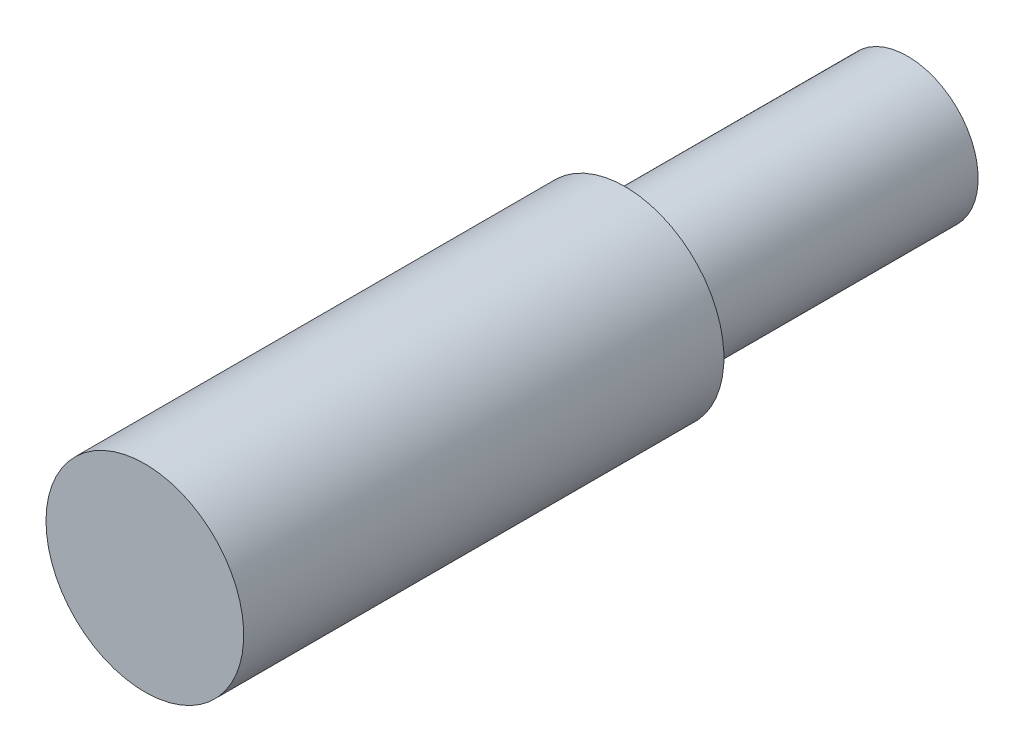
ISO-10303-21;
HEADER;
FILE_DESCRIPTION(('STEP AP214'),'2;1');
FILE_NAME('part.step','',(''),(''),'','','');
FILE_SCHEMA(('AUTOMOTIVE_DESIGN { 1 0 10303 214 1 1 1 1 }'));
ENDSEC;
DATA;
#1=APPLICATION_CONTEXT('core data for automotive mechanical design processes');
#2=APPLICATION_PROTOCOL_DEFINITION('international standard','automotive_design',2000,#1);
#3=PRODUCT_CONTEXT('',#1,'mechanical');
#4=PRODUCT('Part','Part','',(#3));
#5=PRODUCT_RELATED_PRODUCT_CATEGORY('part','',(#4));
#6=PRODUCT_DEFINITION_FORMATION('','',#4);
#7=PRODUCT_DEFINITION_CONTEXT('part definition',#1,'design');
#8=PRODUCT_DEFINITION('design','',#6,#7);
#9=PRODUCT_DEFINITION_SHAPE('','',#8);
#10=(LENGTH_UNIT() NAMED_UNIT(*) SI_UNIT(.MILLI.,.METRE.));
#11=(NAMED_UNIT(*) PLANE_ANGLE_UNIT() SI_UNIT($,.RADIAN.));
#12=(NAMED_UNIT(*) SI_UNIT($,.STERADIAN.) SOLID_ANGLE_UNIT());
#13=UNCERTAINTY_MEASURE_WITH_UNIT(LENGTH_MEASURE(1.E-05),#10,'distance_accuracy_value','');
#14=(GEOMETRIC_REPRESENTATION_CONTEXT(3) GLOBAL_UNCERTAINTY_ASSIGNED_CONTEXT((#13)) GLOBAL_UNIT_ASSIGNED_CONTEXT((#10,
#11,#12)) REPRESENTATION_CONTEXT('',''));
#15=CARTESIAN_POINT('',(0.,0.,0.));
#16=DIRECTION('',(0.,0.,1.));
#17=DIRECTION('',(1.,0.,0.));
#18=AXIS2_PLACEMENT_3D('',#15,#16,#17);
#19=CARTESIAN_POINT('',(15.0577693515358,-8.76138370373442,-34.));
#20=DIRECTION('',(0.,0.,1.));
#21=DIRECTION('',(1.,0.,0.));
#22=AXIS2_PLACEMENT_3D('',#19,#20,#21);
#23=CYLINDRICAL_SURFACE('',#22,7.);
#24=CARTESIAN_POINT('',(15.0577693515358,-8.76138370373442,-34.));
#25=DIRECTION('',(0.,0.,-1.));
#26=DIRECTION('',(-1.,0.,0.));
#27=AXIS2_PLACEMENT_3D('',#24,#25,#26);
#28=CIRCLE('',#27,7.);
#29=CARTESIAN_POINT('',(8.05776935153577,-8.76138370373442,-34.));
#30=VERTEX_POINT('',#29);
#31=EDGE_CURVE('E10',#30,#30,#28,.T.);
#32=ORIENTED_EDGE('',*,*,#31,.F.);
#33=EDGE_LOOP('',(#32));
#34=FACE_BOUND('',#33,.T.);
#35=CARTESIAN_POINT('',(15.0577693515358,-8.76138370373442,0.));
#36=DIRECTION('',(0.,0.,-1.));
#37=DIRECTION('',(-1.,0.,0.));
#38=AXIS2_PLACEMENT_3D('',#35,#36,#37);
#39=CIRCLE('',#38,7.);
#40=CARTESIAN_POINT('',(8.05776935153577,-8.76138370373442,0.));
#41=VERTEX_POINT('',#40);
#42=EDGE_CURVE('E34',#41,#41,#39,.T.);
#43=ORIENTED_EDGE('',*,*,#42,.T.);
#44=EDGE_LOOP('',(#43));
#45=FACE_BOUND('',#44,.T.);
#46=ADVANCED_FACE('F31',(#34,#45),#23,.T.);
#47=CARTESIAN_POINT('',(15.0577693515358,-8.76138370373442,-34.));
#48=DIRECTION('',(0.,0.,-1.));
#49=DIRECTION('',(-1.,0.,0.));
#50=AXIS2_PLACEMENT_3D('',#47,#48,#49);
#51=PLANE('',#50);
#52=CARTESIAN_POINT('',(15.0577693515358,-8.76138370373442,-34.));
#53=DIRECTION('',(0.,0.,-1.));
#54=DIRECTION('',(-1.,0.,0.));
#55=AXIS2_PLACEMENT_3D('',#52,#53,#54);
#56=CIRCLE('',#55,5.);
#57=CARTESIAN_POINT('',(10.0577693515358,-8.76138370373442,-34.));
#58=VERTEX_POINT('',#57);
#59=EDGE_CURVE('E43',#58,#58,#56,.T.);
#60=ORIENTED_EDGE('',*,*,#59,.F.);
#61=EDGE_LOOP('',(#60));
#62=FACE_BOUND('',#61,.T.);
#63=ORIENTED_EDGE('',*,*,#31,.T.);
#64=EDGE_LOOP('',(#63));
#65=FACE_BOUND('',#64,.T.);
#66=ADVANCED_FACE('F76',(#62,#65),#51,.T.);
#67=CARTESIAN_POINT('',(15.0577693515358,-8.76138370373442,0.));
#68=DIRECTION('',(0.,0.,-1.));
#69=DIRECTION('',(-1.,0.,0.));
#70=AXIS2_PLACEMENT_3D('',#67,#68,#69);
#71=PLANE('',#70);
#72=ORIENTED_EDGE('',*,*,#42,.F.);
#73=EDGE_LOOP('',(#72));
#74=FACE_BOUND('',#73,.T.);
#75=ADVANCED_FACE('F72',(#74),#71,.F.);
#76=CARTESIAN_POINT('',(15.0577693515358,-8.76138370373442,-54.));
#77=DIRECTION('',(0.,0.,1.));
#78=DIRECTION('',(1.,0.,0.));
#79=AXIS2_PLACEMENT_3D('',#76,#77,#78);
#80=CYLINDRICAL_SURFACE('',#79,5.);
#81=CARTESIAN_POINT('',(15.0577693515358,-8.76138370373442,-54.));
#82=DIRECTION('',(0.,0.,-1.));
#83=DIRECTION('',(-1.,0.,0.));
#84=AXIS2_PLACEMENT_3D('',#81,#82,#83);
#85=CIRCLE('',#84,5.);
#86=CARTESIAN_POINT('',(10.0577693515358,-8.76138370373442,-54.));
#87=VERTEX_POINT('',#86);
#88=EDGE_CURVE('E41',#87,#87,#85,.T.);
#89=ORIENTED_EDGE('',*,*,#88,.F.);
#90=EDGE_LOOP('',(#89));
#91=FACE_BOUND('',#90,.T.);
#92=ORIENTED_EDGE('',*,*,#59,.T.);
#93=EDGE_LOOP('',(#92));
#94=FACE_BOUND('',#93,.T.);
#95=ADVANCED_FACE('F66',(#91,#94),#80,.T.);
#96=CARTESIAN_POINT('',(15.0577693515358,-8.76138370373442,-54.));
#97=DIRECTION('',(0.,0.,-1.));
#98=DIRECTION('',(-1.,0.,0.));
#99=AXIS2_PLACEMENT_3D('',#96,#97,#98);
#100=PLANE('',#99);
#101=CARTESIAN_POINT('',(15.0577693515358,-8.76138370373442,-54.));
#102=DIRECTION('',(0.,0.,-1.));
#103=DIRECTION('',(1.,0.,0.));
#104=AXIS2_PLACEMENT_3D('',#101,#102,#103);
#105=CIRCLE('',#104,3.);
#106=CARTESIAN_POINT('',(18.0577693515358,-8.76138370373442,-54.));
#107=VERTEX_POINT('',#106);
#108=EDGE_CURVE('E49',#107,#107,#105,.T.);
#109=ORIENTED_EDGE('',*,*,#108,.F.);
#110=EDGE_LOOP('',(#109));
#111=FACE_BOUND('',#110,.T.);
#112=ORIENTED_EDGE('',*,*,#88,.T.);
#113=EDGE_LOOP('',(#112));
#114=FACE_BOUND('',#113,.T.);
#115=ADVANCED_FACE('F60',(#111,#114),#100,.T.);
#116=CARTESIAN_POINT('',(15.0577693515358,-8.76138370373442,-25.0000000000001));
#117=DIRECTION('',(0.,0.,-1.));
#118=DIRECTION('',(-1.,0.,0.));
#119=AXIS2_PLACEMENT_3D('',#116,#117,#118);
#120=CYLINDRICAL_SURFACE('',#119,3.);
#121=CARTESIAN_POINT('',(15.0577693515358,-8.76138370373442,-25.0000000000001));
#122=DIRECTION('',(0.,0.,-1.));
#123=DIRECTION('',(1.,0.,0.));
#124=AXIS2_PLACEMENT_3D('',#121,#122,#123);
#125=CIRCLE('',#124,3.);
#126=CARTESIAN_POINT('',(18.0577693515358,-8.76138370373442,-25.0000000000001));
#127=VERTEX_POINT('',#126);
#128=EDGE_CURVE('E46',#127,#127,#125,.T.);
#129=ORIENTED_EDGE('',*,*,#128,.F.);
#130=EDGE_LOOP('',(#129));
#131=FACE_BOUND('',#130,.T.);
#132=ORIENTED_EDGE('',*,*,#108,.T.);
#133=EDGE_LOOP('',(#132));
#134=FACE_BOUND('',#133,.T.);
#135=ADVANCED_FACE('F57',(#131,#134),#120,.F.);
#136=CARTESIAN_POINT('',(15.0577693515358,-8.76138370373442,-25.0000000000001));
#137=DIRECTION('',(0.,0.,1.));
#138=DIRECTION('',(1.,0.,0.));
#139=AXIS2_PLACEMENT_3D('',#136,#137,#138);
#140=PLANE('',#139);
#141=ORIENTED_EDGE('',*,*,#128,.T.);
#142=EDGE_LOOP('',(#141));
#143=FACE_BOUND('',#142,.T.);
#144=ADVANCED_FACE('F55',(#143),#140,.F.);
#145=CLOSED_SHELL('',(#46,#66,#75,#95,#115,#135,#144));
#146=MANIFOLD_SOLID_BREP('B2',#145);
#147=ADVANCED_BREP_SHAPE_REPRESENTATION('',(#18,#146),#14);
#148=SHAPE_DEFINITION_REPRESENTATION(#9,#147);
ENDSEC;
END-ISO-10303-21;
